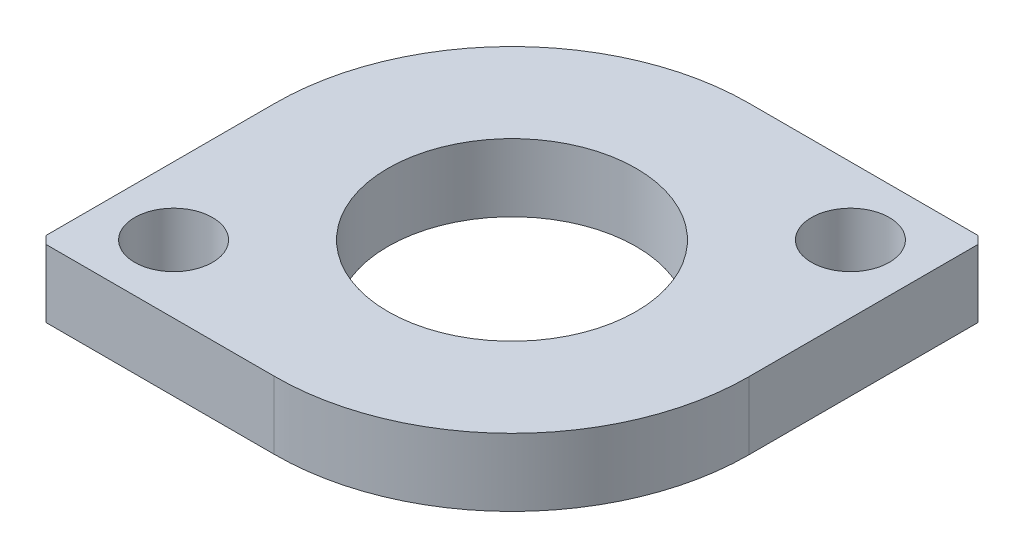
ISO-10303-21;
HEADER;
FILE_DESCRIPTION(('STEP AP214'),'2;1');
FILE_NAME('part.step','',(''),(''),'','','');
FILE_SCHEMA(('AUTOMOTIVE_DESIGN { 1 0 10303 214 1 1 1 1 }'));
ENDSEC;
DATA;
#1=APPLICATION_CONTEXT('core data for automotive mechanical design processes');
#2=APPLICATION_PROTOCOL_DEFINITION('international standard','automotive_design',2000,#1);
#3=PRODUCT_CONTEXT('',#1,'mechanical');
#4=PRODUCT('Part','Part','',(#3));
#5=PRODUCT_RELATED_PRODUCT_CATEGORY('part','',(#4));
#6=PRODUCT_DEFINITION_FORMATION('','',#4);
#7=PRODUCT_DEFINITION_CONTEXT('part definition',#1,'design');
#8=PRODUCT_DEFINITION('design','',#6,#7);
#9=PRODUCT_DEFINITION_SHAPE('','',#8);
#10=(LENGTH_UNIT() NAMED_UNIT(*) SI_UNIT(.MILLI.,.METRE.));
#11=(NAMED_UNIT(*) PLANE_ANGLE_UNIT() SI_UNIT($,.RADIAN.));
#12=(NAMED_UNIT(*) SI_UNIT($,.STERADIAN.) SOLID_ANGLE_UNIT());
#13=UNCERTAINTY_MEASURE_WITH_UNIT(LENGTH_MEASURE(1.E-05),#10,'distance_accuracy_value','');
#14=(GEOMETRIC_REPRESENTATION_CONTEXT(3) GLOBAL_UNCERTAINTY_ASSIGNED_CONTEXT((#13)) GLOBAL_UNIT_ASSIGNED_CONTEXT((#10,
#11,#12)) REPRESENTATION_CONTEXT('',''));
#15=CARTESIAN_POINT('',(0.,0.,0.));
#16=DIRECTION('',(0.,0.,1.));
#17=DIRECTION('',(1.,0.,0.));
#18=AXIS2_PLACEMENT_3D('',#15,#16,#17);
#19=CARTESIAN_POINT('',(49.7000030517576,444.899955749512,708.800012779236));
#20=DIRECTION('',(1.,0.,0.));
#21=DIRECTION('',(0.,0.,-1.));
#22=AXIS2_PLACEMENT_3D('',#19,#20,#21);
#23=PLANE('',#22);
#24=DIRECTION('',(0.,1.,0.));
#25=VECTOR('',#24,1.);
#26=CARTESIAN_POINT('',(49.7000030517576,444.899955749512,707.799881142441));
#27=LINE('',#26,#25);
#28=CARTESIAN_POINT('',(49.7000030517576,443.399955749512,707.799881142441));
#29=VERTEX_POINT('',#28);
#30=CARTESIAN_POINT('',(49.7000030517576,446.399955749512,707.799881142441));
#31=VERTEX_POINT('',#30);
#32=EDGE_CURVE('E10',#29,#31,#27,.T.);
#33=ORIENTED_EDGE('',*,*,#32,.T.);
#34=DIRECTION('',(0.,0.,1.));
#35=VECTOR('',#34,1.);
#36=CARTESIAN_POINT('',(49.7000030517576,446.399955749512,708.800012779236));
#37=LINE('',#36,#35);
#38=CARTESIAN_POINT('',(49.7000030517576,446.399955749512,707.800008964538));
#39=VERTEX_POINT('',#38);
#40=EDGE_CURVE('E25',#31,#39,#37,.T.);
#41=ORIENTED_EDGE('',*,*,#40,.T.);
#42=DIRECTION('',(0.,-1.,0.));
#43=VECTOR('',#42,1.);
#44=CARTESIAN_POINT('',(49.7000030517576,444.899955749512,707.800008964538));
#45=LINE('',#44,#43);
#46=CARTESIAN_POINT('',(49.7000030517576,443.399955749512,707.800008964538));
#47=VERTEX_POINT('',#46);
#48=EDGE_CURVE('E351',#39,#47,#45,.T.);
#49=ORIENTED_EDGE('',*,*,#48,.T.);
#50=DIRECTION('',(0.,0.,1.));
#51=VECTOR('',#50,1.);
#52=CARTESIAN_POINT('',(49.7000030517576,443.399955749512,708.800012779236));
#53=LINE('',#52,#51);
#54=EDGE_CURVE('E176',#29,#47,#53,.T.);
#55=ORIENTED_EDGE('',*,*,#54,.F.);
#56=EDGE_LOOP('',(#33,#41,#49,#55));
#57=FACE_BOUND('',#56,.T.);
#58=ADVANCED_FACE('F15',(#57),#23,.T.);
#59=CARTESIAN_POINT('',(49.7500030517576,444.899955749512,697.300000190735));
#60=DIRECTION('',(0.,-1.,0.));
#61=DIRECTION('',(0.,0.,-1.));
#62=AXIS2_PLACEMENT_3D('',#59,#60,#61);
#63=CYLINDRICAL_SURFACE('',#62,10.5);
#64=ORIENTED_EDGE('',*,*,#32,.F.);
#65=CARTESIAN_POINT('',(49.7500030517576,443.399955749512,697.300000190735));
#66=DIRECTION('',(0.,1.,0.));
#67=DIRECTION('',(0.,0.,-1.));
#68=AXIS2_PLACEMENT_3D('',#65,#66,#67);
#69=CIRCLE('',#68,10.5);
#70=CARTESIAN_POINT('',(60.2499963760375,443.399955749512,697.300000190735));
#71=VERTEX_POINT('',#70);
#72=EDGE_CURVE('E344',#29,#71,#69,.T.);
#73=ORIENTED_EDGE('',*,*,#72,.T.);
#74=DIRECTION('',(0.,1.,0.));
#75=VECTOR('',#74,1.);
#76=CARTESIAN_POINT('',(60.2499963760375,444.899955749512,697.300000190735));
#77=LINE('',#76,#75);
#78=CARTESIAN_POINT('',(60.2499963760375,446.399955749512,697.300000190735));
#79=VERTEX_POINT('',#78);
#80=EDGE_CURVE('E346',#71,#79,#77,.T.);
#81=ORIENTED_EDGE('',*,*,#80,.T.);
#82=CARTESIAN_POINT('',(49.7500030517576,446.399955749512,697.300000190735));
#83=DIRECTION('',(0.,-1.,0.));
#84=DIRECTION('',(0.,0.,-1.));
#85=AXIS2_PLACEMENT_3D('',#82,#83,#84);
#86=CIRCLE('',#85,10.5);
#87=EDGE_CURVE('E348',#79,#31,#86,.T.);
#88=ORIENTED_EDGE('',*,*,#87,.T.);
#89=EDGE_LOOP('',(#64,#73,#81,#88));
#90=FACE_BOUND('',#89,.T.);
#91=ADVANCED_FACE('F201',(#90),#63,.T.);
#92=CARTESIAN_POINT('',(42.2500030517576,438.149935007095,707.800012779236));
#93=DIRECTION('',(0.,0.,-1.));
#94=DIRECTION('',(-1.,0.,0.));
#95=AXIS2_PLACEMENT_3D('',#92,#93,#94);
#96=PLANE('',#95);
#97=DIRECTION('',(1.,0.,0.));
#98=VECTOR('',#97,1.);
#99=CARTESIAN_POINT('',(47.2000030517576,443.399955749512,707.800008964538));
#100=LINE('',#99,#98);
#101=CARTESIAN_POINT('',(39.6042660147797,443.399955749512,707.800012779236));
#102=VERTEX_POINT('',#101);
#103=EDGE_CURVE('E168',#102,#47,#100,.T.);
#104=ORIENTED_EDGE('',*,*,#103,.T.);
#105=ORIENTED_EDGE('',*,*,#48,.F.);
#106=DIRECTION('',(1.,0.,0.));
#107=VECTOR('',#106,1.);
#108=CARTESIAN_POINT('',(46.0000030517576,446.399955749512,707.800012779236));
#109=LINE('',#108,#107);
#110=CARTESIAN_POINT('',(39.6042660147797,446.399955749512,707.800012779236));
#111=VERTEX_POINT('',#110);
#112=EDGE_CURVE('E127',#111,#39,#109,.T.);
#113=ORIENTED_EDGE('',*,*,#112,.F.);
#114=DIRECTION('',(0.,-1.,0.));
#115=VECTOR('',#114,1.);
#116=CARTESIAN_POINT('',(39.6042660147797,444.899955749512,707.800012779236));
#117=LINE('',#116,#115);
#118=EDGE_CURVE('E170',#111,#102,#117,.T.);
#119=ORIENTED_EDGE('',*,*,#118,.T.);
#120=EDGE_LOOP('',(#104,#105,#113,#119));
#121=FACE_BOUND('',#120,.T.);
#122=ADVANCED_FACE('F207',(#121),#96,.F.);
#123=CARTESIAN_POINT('',(60.2500001907347,440.649952888489,689.800000190735));
#124=DIRECTION('',(-1.,0.,0.));
#125=DIRECTION('',(0.,0.,-1.));
#126=AXIS2_PLACEMENT_3D('',#123,#124,#125);
#127=PLANE('',#126);
#128=DIRECTION('',(0.,0.,1.));
#129=VECTOR('',#128,1.);
#130=CARTESIAN_POINT('',(60.2499963760375,446.399955749512,694.300000190735));
#131=LINE('',#130,#129);
#132=CARTESIAN_POINT('',(60.2500001907347,446.399953842163,687.154245635579));
#133=VERTEX_POINT('',#132);
#134=EDGE_CURVE('E104',#133,#79,#131,.T.);
#135=ORIENTED_EDGE('',*,*,#134,.T.);
#136=ORIENTED_EDGE('',*,*,#80,.F.);
#137=DIRECTION('',(0.,0.,1.));
#138=VECTOR('',#137,1.);
#139=CARTESIAN_POINT('',(60.2500001907347,443.399955749512,693.550000190735));
#140=LINE('',#139,#138);
#141=CARTESIAN_POINT('',(60.2500001907347,443.399953842163,687.154245635579));
#142=VERTEX_POINT('',#141);
#143=EDGE_CURVE('E146',#142,#71,#140,.T.);
#144=ORIENTED_EDGE('',*,*,#143,.F.);
#145=DIRECTION('',(0.,1.,0.));
#146=VECTOR('',#145,1.);
#147=CARTESIAN_POINT('',(60.2500001907347,444.899953842163,687.154245635579));
#148=LINE('',#147,#146);
#149=EDGE_CURVE('E173',#142,#133,#148,.T.);
#150=ORIENTED_EDGE('',*,*,#149,.T.);
#151=EDGE_LOOP('',(#135,#136,#144,#150));
#152=FACE_BOUND('',#151,.T.);
#153=ADVANCED_FACE('F213',(#152),#127,.F.);
#154=CARTESIAN_POINT('',(42.2500030517577,444.899955749512,704.800000190735));
#155=DIRECTION('',(0.,1.,0.));
#156=DIRECTION('',(1.,0.,0.));
#157=AXIS2_PLACEMENT_3D('',#154,#155,#156);
#158=CYLINDRICAL_SURFACE('',#157,4.);
#159=CARTESIAN_POINT('',(42.2500030517576,446.399955749512,704.800000190735));
#160=DIRECTION('',(0.,-1.,0.));
#161=DIRECTION('',(0.,0.,-1.));
#162=AXIS2_PLACEMENT_3D('',#159,#160,#161);
#163=CIRCLE('',#162,4.);
#164=CARTESIAN_POINT('',(39.2499904632568,446.399955749512,707.445737227713));
#165=VERTEX_POINT('',#164);
#166=EDGE_CURVE('E178',#111,#165,#163,.T.);
#167=ORIENTED_EDGE('',*,*,#166,.T.);
#168=DIRECTION('',(0.,-1.,0.));
#169=VECTOR('',#168,1.);
#170=CARTESIAN_POINT('',(39.2499904632568,444.899955749512,707.445737227713));
#171=LINE('',#170,#169);
#172=CARTESIAN_POINT('',(39.2499904632568,443.399955749512,707.445737227713));
#173=VERTEX_POINT('',#172);
#174=EDGE_CURVE('E181',#165,#173,#171,.T.);
#175=ORIENTED_EDGE('',*,*,#174,.T.);
#176=CARTESIAN_POINT('',(42.2500030517577,443.399955749512,704.800000190735));
#177=DIRECTION('',(0.,-1.,0.));
#178=DIRECTION('',(1.,0.,0.));
#179=AXIS2_PLACEMENT_3D('',#176,#177,#178);
#180=CIRCLE('',#179,4.);
#181=EDGE_CURVE('E152',#102,#173,#180,.T.);
#182=ORIENTED_EDGE('',*,*,#181,.F.);
#183=ORIENTED_EDGE('',*,*,#118,.F.);
#184=EDGE_LOOP('',(#167,#175,#182,#183));
#185=FACE_BOUND('',#184,.T.);
#186=ADVANCED_FACE('F217',(#185),#158,.T.);
#187=CARTESIAN_POINT('',(49.7500030517577,443.399955749512,697.300000190735));
#188=DIRECTION('',(0.,-1.,0.));
#189=DIRECTION('',(-1.,0.,0.));
#190=AXIS2_PLACEMENT_3D('',#187,#188,#189);
#191=PLANE('',#190);
#192=CARTESIAN_POINT('',(57.2500030517577,443.399955749512,689.800000190735));
#193=DIRECTION('',(0.,1.,0.));
#194=DIRECTION('',(1.,0.,0.));
#195=AXIS2_PLACEMENT_3D('',#192,#193,#194);
#196=CIRCLE('',#195,1.725);
#197=CARTESIAN_POINT('',(58.9750030517577,443.399955749512,689.800000190735));
#198=VERTEX_POINT('',#197);
#199=EDGE_CURVE('E144',#198,#198,#196,.T.);
#200=ORIENTED_EDGE('',*,*,#199,.T.);
#201=EDGE_LOOP('',(#200));
#202=FACE_BOUND('',#201,.T.);
#203=CARTESIAN_POINT('',(49.7500030517577,443.399955749512,697.300000190735));
#204=DIRECTION('',(0.,1.,0.));
#205=DIRECTION('',(1.,0.,0.));
#206=AXIS2_PLACEMENT_3D('',#203,#204,#205);
#207=CIRCLE('',#206,5.5);
#208=CARTESIAN_POINT('',(55.2500030517577,443.399955749512,697.300000190735));
#209=VERTEX_POINT('',#208);
#210=EDGE_CURVE('E141',#209,#209,#207,.T.);
#211=ORIENTED_EDGE('',*,*,#210,.T.);
#212=EDGE_LOOP('',(#211));
#213=FACE_BOUND('',#212,.T.);
#214=CARTESIAN_POINT('',(42.2500030517577,443.399955749512,704.800000190735));
#215=DIRECTION('',(0.,1.,0.));
#216=DIRECTION('',(1.,0.,0.));
#217=AXIS2_PLACEMENT_3D('',#214,#215,#216);
#218=CIRCLE('',#217,1.725);
#219=CARTESIAN_POINT('',(43.9750030517577,443.399955749512,704.800000190735));
#220=VERTEX_POINT('',#219);
#221=EDGE_CURVE('E139',#220,#220,#218,.T.);
#222=ORIENTED_EDGE('',*,*,#221,.T.);
#223=EDGE_LOOP('',(#222));
#224=FACE_BOUND('',#223,.T.);
#225=CARTESIAN_POINT('',(57.2500030517577,443.399953842163,689.800000190735));
#226=DIRECTION('',(0.,-1.,0.));
#227=DIRECTION('',(1.,0.,0.));
#228=AXIS2_PLACEMENT_3D('',#225,#226,#227);
#229=CIRCLE('',#228,4.);
#230=CARTESIAN_POINT('',(59.8957576069138,443.399953842163,686.800003051758));
#231=VERTEX_POINT('',#230);
#232=EDGE_CURVE('E112',#231,#142,#229,.T.);
#233=ORIENTED_EDGE('',*,*,#232,.T.);
#234=ORIENTED_EDGE('',*,*,#143,.T.);
#235=ORIENTED_EDGE('',*,*,#72,.F.);
#236=ORIENTED_EDGE('',*,*,#54,.T.);
#237=ORIENTED_EDGE('',*,*,#103,.F.);
#238=ORIENTED_EDGE('',*,*,#181,.T.);
#239=DIRECTION('',(0.,0.,-1.));
#240=VECTOR('',#239,1.);
#241=CARTESIAN_POINT('',(39.2499904632568,443.399955749512,701.050000190735));
#242=LINE('',#241,#240);
#243=CARTESIAN_POINT('',(39.2499942779541,443.399955749512,697.350000190735));
#244=VERTEX_POINT('',#243);
#245=EDGE_CURVE('E150',#173,#244,#242,.T.);
#246=ORIENTED_EDGE('',*,*,#245,.T.);
#247=DIRECTION('',(-1.,0.,0.));
#248=VECTOR('',#247,1.);
#249=CARTESIAN_POINT('',(38.2499904632568,443.399955749512,697.350000190735));
#250=LINE('',#249,#248);
#251=CARTESIAN_POINT('',(39.2501221000516,443.399955749512,697.350000190735));
#252=VERTEX_POINT('',#251);
#253=EDGE_CURVE('E154',#252,#244,#250,.T.);
#254=ORIENTED_EDGE('',*,*,#253,.F.);
#255=CARTESIAN_POINT('',(49.7500030517577,443.399955749512,697.300000190735));
#256=DIRECTION('',(0.,-1.,0.));
#257=DIRECTION('',(1.,0.,0.));
#258=AXIS2_PLACEMENT_3D('',#255,#256,#257);
#259=CIRCLE('',#258,10.5);
#260=CARTESIAN_POINT('',(49.7500030517577,443.399955749512,686.800006866455));
#261=VERTEX_POINT('',#260);
#262=EDGE_CURVE('E153',#252,#261,#259,.T.);
#263=ORIENTED_EDGE('',*,*,#262,.T.);
#264=DIRECTION('',(-1.,0.,0.));
#265=VECTOR('',#264,1.);
#266=CARTESIAN_POINT('',(52.7500030517577,443.399955749512,686.800006866455));
#267=LINE('',#266,#265);
#268=EDGE_CURVE('E113',#231,#261,#267,.T.);
#269=ORIENTED_EDGE('',*,*,#268,.F.);
#270=EDGE_LOOP('',(#233,#234,#235,#236,#237,#238,#246,#254,#263,#269));
#271=FACE_BOUND('',#270,.T.);
#272=ADVANCED_FACE('F187',(#202,#213,#224,#271),#191,.T.);
#273=CARTESIAN_POINT('',(38.2499904632568,444.899955749512,697.350000190735));
#274=DIRECTION('',(0.,0.,1.));
#275=DIRECTION('',(1.,0.,0.));
#276=AXIS2_PLACEMENT_3D('',#273,#274,#275);
#277=PLANE('',#276);
#278=DIRECTION('',(0.,1.,0.));
#279=VECTOR('',#278,1.);
#280=CARTESIAN_POINT('',(39.2501221000516,444.899955749512,697.350000190735));
#281=LINE('',#280,#279);
#282=CARTESIAN_POINT('',(39.2501221000516,446.399955749512,697.350000190735));
#283=VERTEX_POINT('',#282);
#284=EDGE_CURVE('E107',#252,#283,#281,.T.);
#285=ORIENTED_EDGE('',*,*,#284,.F.);
#286=ORIENTED_EDGE('',*,*,#253,.T.);
#287=DIRECTION('',(0.,-1.,0.));
#288=VECTOR('',#287,1.);
#289=CARTESIAN_POINT('',(39.2499942779541,444.899955749512,697.350000190735));
#290=LINE('',#289,#288);
#291=CARTESIAN_POINT('',(39.2499942779541,446.399955749512,697.350000190735));
#292=VERTEX_POINT('',#291);
#293=EDGE_CURVE('E115',#292,#244,#290,.T.);
#294=ORIENTED_EDGE('',*,*,#293,.F.);
#295=DIRECTION('',(-1.,0.,0.));
#296=VECTOR('',#295,1.);
#297=CARTESIAN_POINT('',(38.2499904632568,446.399955749512,697.350000190735));
#298=LINE('',#297,#296);
#299=EDGE_CURVE('E162',#283,#292,#298,.T.);
#300=ORIENTED_EDGE('',*,*,#299,.F.);
#301=EDGE_LOOP('',(#285,#286,#294,#300));
#302=FACE_BOUND('',#301,.T.);
#303=ADVANCED_FACE('F224',(#302),#277,.F.);
#304=CARTESIAN_POINT('',(49.7500030517577,444.899955749512,697.300000190735));
#305=DIRECTION('',(0.,1.,0.));
#306=DIRECTION('',(1.,0.,0.));
#307=AXIS2_PLACEMENT_3D('',#304,#305,#306);
#308=CYLINDRICAL_SURFACE('',#307,10.5);
#309=ORIENTED_EDGE('',*,*,#284,.T.);
#310=CARTESIAN_POINT('',(49.7500030517577,446.399955749512,697.300000190735));
#311=DIRECTION('',(0.,1.,0.));
#312=DIRECTION('',(1.,0.,0.));
#313=AXIS2_PLACEMENT_3D('',#310,#311,#312);
#314=CIRCLE('',#313,10.5);
#315=CARTESIAN_POINT('',(49.7500030517577,446.399955749512,686.800006866455));
#316=VERTEX_POINT('',#315);
#317=EDGE_CURVE('E98',#316,#283,#314,.T.);
#318=ORIENTED_EDGE('',*,*,#317,.F.);
#319=DIRECTION('',(0.,1.,0.));
#320=VECTOR('',#319,1.);
#321=CARTESIAN_POINT('',(49.7500030517577,444.899955749512,686.800006866455));
#322=LINE('',#321,#320);
#323=EDGE_CURVE('E95',#261,#316,#322,.T.);
#324=ORIENTED_EDGE('',*,*,#323,.F.);
#325=ORIENTED_EDGE('',*,*,#262,.F.);
#326=EDGE_LOOP('',(#309,#318,#324,#325));
#327=FACE_BOUND('',#326,.T.);
#328=ADVANCED_FACE('F227',(#327),#308,.T.);
#329=CARTESIAN_POINT('',(49.7500030517577,446.399955749512,697.300000190735));
#330=DIRECTION('',(0.,1.,0.));
#331=DIRECTION('',(1.,0.,0.));
#332=AXIS2_PLACEMENT_3D('',#329,#330,#331);
#333=PLANE('',#332);
#334=CARTESIAN_POINT('',(57.2500030517577,446.399953842163,689.800000190735));
#335=DIRECTION('',(0.,1.,0.));
#336=DIRECTION('',(1.,0.,0.));
#337=AXIS2_PLACEMENT_3D('',#334,#335,#336);
#338=CIRCLE('',#337,4.);
#339=CARTESIAN_POINT('',(59.8957576069138,446.399953842163,686.800003051758));
#340=VERTEX_POINT('',#339);
#341=EDGE_CURVE('E97',#133,#340,#338,.T.);
#342=ORIENTED_EDGE('',*,*,#341,.T.);
#343=DIRECTION('',(-1.,0.,0.));
#344=VECTOR('',#343,1.);
#345=CARTESIAN_POINT('',(53.5000030517577,446.399955749512,686.800003051758));
#346=LINE('',#345,#344);
#347=EDGE_CURVE('E88',#340,#316,#346,.T.);
#348=ORIENTED_EDGE('',*,*,#347,.T.);
#349=ORIENTED_EDGE('',*,*,#317,.T.);
#350=ORIENTED_EDGE('',*,*,#299,.T.);
#351=DIRECTION('',(0.,0.,-1.));
#352=VECTOR('',#351,1.);
#353=CARTESIAN_POINT('',(39.2499942779541,446.399955749512,699.850000190735));
#354=LINE('',#353,#352);
#355=EDGE_CURVE('E120',#165,#292,#354,.T.);
#356=ORIENTED_EDGE('',*,*,#355,.F.);
#357=ORIENTED_EDGE('',*,*,#166,.F.);
#358=ORIENTED_EDGE('',*,*,#112,.T.);
#359=ORIENTED_EDGE('',*,*,#40,.F.);
#360=ORIENTED_EDGE('',*,*,#87,.F.);
#361=ORIENTED_EDGE('',*,*,#134,.F.);
#362=EDGE_LOOP('',(#342,#348,#349,#350,#356,#357,#358,#359,#360,#361));
#363=FACE_BOUND('',#362,.T.);
#364=CARTESIAN_POINT('',(57.2500030517577,446.399955749512,689.800000190735));
#365=DIRECTION('',(0.,-1.,0.));
#366=DIRECTION('',(1.,0.,0.));
#367=AXIS2_PLACEMENT_3D('',#364,#365,#366);
#368=CIRCLE('',#367,1.725);
#369=CARTESIAN_POINT('',(58.9750030517577,446.399955749512,689.800000190735));
#370=VERTEX_POINT('',#369);
#371=EDGE_CURVE('E124',#370,#370,#368,.T.);
#372=ORIENTED_EDGE('',*,*,#371,.T.);
#373=EDGE_LOOP('',(#372));
#374=FACE_BOUND('',#373,.T.);
#375=CARTESIAN_POINT('',(49.7500030517577,446.399955749512,697.300000190735));
#376=DIRECTION('',(0.,-1.,0.));
#377=DIRECTION('',(1.,0.,0.));
#378=AXIS2_PLACEMENT_3D('',#375,#376,#377);
#379=CIRCLE('',#378,5.5);
#380=CARTESIAN_POINT('',(55.2500030517577,446.399955749512,697.300000190735));
#381=VERTEX_POINT('',#380);
#382=EDGE_CURVE('E128',#381,#381,#379,.T.);
#383=ORIENTED_EDGE('',*,*,#382,.T.);
#384=EDGE_LOOP('',(#383));
#385=FACE_BOUND('',#384,.T.);
#386=CARTESIAN_POINT('',(42.2500030517577,446.399955749512,704.800000190735));
#387=DIRECTION('',(0.,-1.,0.));
#388=DIRECTION('',(1.,0.,0.));
#389=AXIS2_PLACEMENT_3D('',#386,#387,#388);
#390=CIRCLE('',#389,1.725);
#391=CARTESIAN_POINT('',(43.9750030517577,446.399955749512,704.800000190735));
#392=VERTEX_POINT('',#391);
#393=EDGE_CURVE('E123',#392,#392,#390,.T.);
#394=ORIENTED_EDGE('',*,*,#393,.T.);
#395=EDGE_LOOP('',(#394));
#396=FACE_BOUND('',#395,.T.);
#397=ADVANCED_FACE('F102',(#363,#374,#385,#396),#333,.T.);
#398=CARTESIAN_POINT('',(39.2499904632568,438.149935007095,704.800000190735));
#399=DIRECTION('',(-1.,0.,0.));
#400=DIRECTION('',(0.,0.,1.));
#401=AXIS2_PLACEMENT_3D('',#398,#399,#400);
#402=PLANE('',#401);
#403=ORIENTED_EDGE('',*,*,#245,.F.);
#404=ORIENTED_EDGE('',*,*,#174,.F.);
#405=ORIENTED_EDGE('',*,*,#355,.T.);
#406=ORIENTED_EDGE('',*,*,#293,.T.);
#407=EDGE_LOOP('',(#403,#404,#405,#406));
#408=FACE_BOUND('',#407,.T.);
#409=ADVANCED_FACE('F234',(#408),#402,.T.);
#410=CARTESIAN_POINT('',(57.2500030517577,440.649952888489,686.800003051758));
#411=DIRECTION('',(0.,0.,-1.));
#412=DIRECTION('',(1.,0.,0.));
#413=AXIS2_PLACEMENT_3D('',#410,#411,#412);
#414=PLANE('',#413);
#415=ORIENTED_EDGE('',*,*,#347,.F.);
#416=DIRECTION('',(0.,1.,0.));
#417=VECTOR('',#416,1.);
#418=CARTESIAN_POINT('',(59.8957576069138,444.899953842163,686.800003051758));
#419=LINE('',#418,#417);
#420=EDGE_CURVE('E19',#231,#340,#419,.T.);
#421=ORIENTED_EDGE('',*,*,#420,.F.);
#422=ORIENTED_EDGE('',*,*,#268,.T.);
#423=ORIENTED_EDGE('',*,*,#323,.T.);
#424=EDGE_LOOP('',(#415,#421,#422,#423));
#425=FACE_BOUND('',#424,.T.);
#426=ADVANCED_FACE('F92',(#425),#414,.T.);
#427=CARTESIAN_POINT('',(57.2500030517577,444.899953842163,689.800000190735));
#428=DIRECTION('',(0.,-1.,0.));
#429=DIRECTION('',(1.,0.,0.));
#430=AXIS2_PLACEMENT_3D('',#427,#428,#429);
#431=CYLINDRICAL_SURFACE('',#430,4.);
#432=ORIENTED_EDGE('',*,*,#232,.F.);
#433=ORIENTED_EDGE('',*,*,#420,.T.);
#434=ORIENTED_EDGE('',*,*,#341,.F.);
#435=ORIENTED_EDGE('',*,*,#149,.F.);
#436=EDGE_LOOP('',(#432,#433,#434,#435));
#437=FACE_BOUND('',#436,.T.);
#438=ADVANCED_FACE('F110',(#437),#431,.T.);
#439=CARTESIAN_POINT('',(49.7500030517577,444.399955749512,697.300000190735));
#440=DIRECTION('',(0.,-1.,0.));
#441=DIRECTION('',(1.,0.,0.));
#442=AXIS2_PLACEMENT_3D('',#439,#440,#441);
#443=CYLINDRICAL_SURFACE('',#442,5.5);
#444=ORIENTED_EDGE('',*,*,#382,.F.);
#445=EDGE_LOOP('',(#444));
#446=FACE_BOUND('',#445,.T.);
#447=ORIENTED_EDGE('',*,*,#210,.F.);
#448=EDGE_LOOP('',(#447));
#449=FACE_BOUND('',#448,.T.);
#450=ADVANCED_FACE('F191',(#446,#449),#443,.F.);
#451=CARTESIAN_POINT('',(57.2500030517577,444.399953842163,689.800000190735));
#452=DIRECTION('',(0.,1.,0.));
#453=DIRECTION('',(1.,0.,0.));
#454=AXIS2_PLACEMENT_3D('',#451,#452,#453);
#455=CYLINDRICAL_SURFACE('',#454,1.725);
#456=ORIENTED_EDGE('',*,*,#371,.F.);
#457=EDGE_LOOP('',(#456));
#458=FACE_BOUND('',#457,.T.);
#459=ORIENTED_EDGE('',*,*,#199,.F.);
#460=EDGE_LOOP('',(#459));
#461=FACE_BOUND('',#460,.T.);
#462=ADVANCED_FACE('F136',(#458,#461),#455,.F.);
#463=CARTESIAN_POINT('',(42.2500030517577,444.399953842163,704.800000190735));
#464=DIRECTION('',(0.,1.,0.));
#465=DIRECTION('',(1.,0.,0.));
#466=AXIS2_PLACEMENT_3D('',#463,#464,#465);
#467=CYLINDRICAL_SURFACE('',#466,1.725);
#468=ORIENTED_EDGE('',*,*,#393,.F.);
#469=EDGE_LOOP('',(#468));
#470=FACE_BOUND('',#469,.T.);
#471=ORIENTED_EDGE('',*,*,#221,.F.);
#472=EDGE_LOOP('',(#471));
#473=FACE_BOUND('',#472,.T.);
#474=ADVANCED_FACE('F17',(#470,#473),#467,.F.);
#475=CLOSED_SHELL('',(#58,#91,#122,#153,#186,#272,#303,#328,#397,#409,#426,#438,#450,#462,#474));
#476=MANIFOLD_SOLID_BREP('B1',#475);
#477=ADVANCED_BREP_SHAPE_REPRESENTATION('',(#18,#476),#14);
#478=SHAPE_DEFINITION_REPRESENTATION(#9,#477);
ENDSEC;
END-ISO-10303-21;
